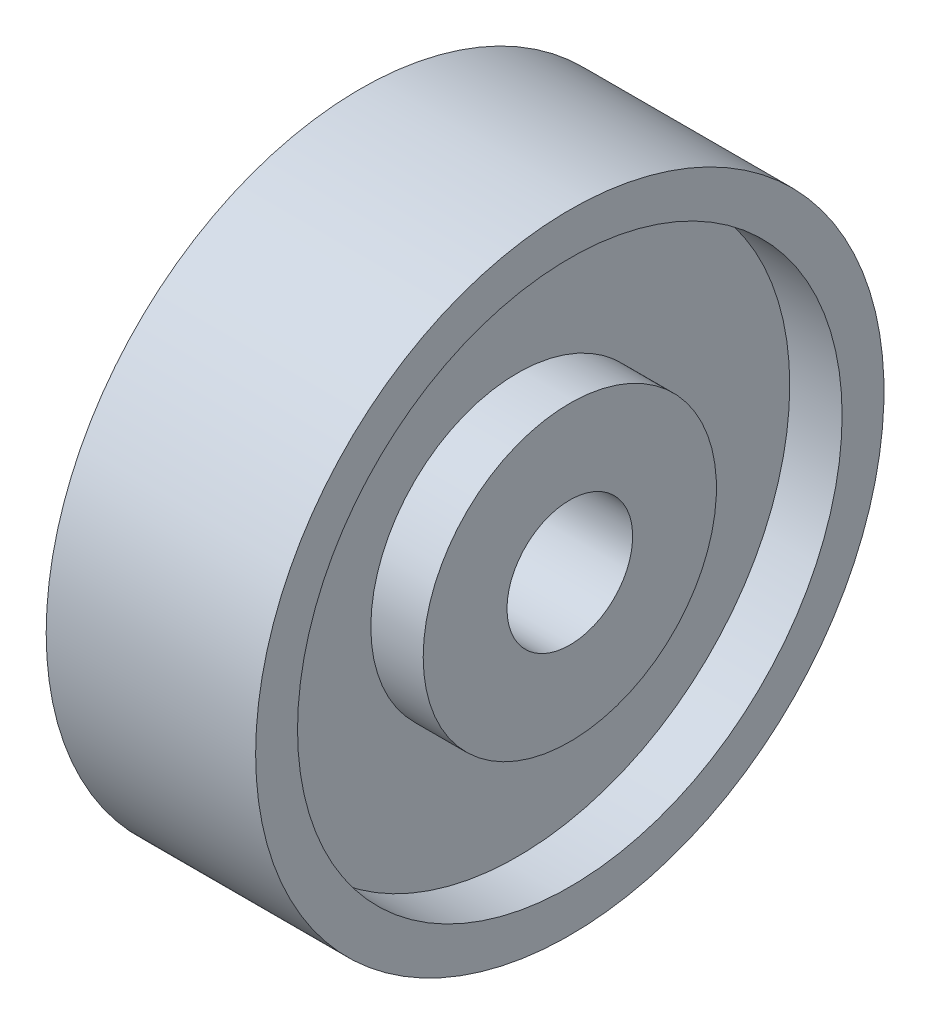
ISO-10303-21;
HEADER;
FILE_DESCRIPTION(('STEP AP214'),'2;1');
FILE_NAME('part.step','',(''),(''),'','','');
FILE_SCHEMA(('AUTOMOTIVE_DESIGN { 1 0 10303 214 1 1 1 1 }'));
ENDSEC;
DATA;
#1=APPLICATION_CONTEXT('core data for automotive mechanical design processes');
#2=APPLICATION_PROTOCOL_DEFINITION('international standard','automotive_design',2000,#1);
#3=PRODUCT_CONTEXT('',#1,'mechanical');
#4=PRODUCT('Part','Part','',(#3));
#5=PRODUCT_RELATED_PRODUCT_CATEGORY('part','',(#4));
#6=PRODUCT_DEFINITION_FORMATION('','',#4);
#7=PRODUCT_DEFINITION_CONTEXT('part definition',#1,'design');
#8=PRODUCT_DEFINITION('design','',#6,#7);
#9=PRODUCT_DEFINITION_SHAPE('','',#8);
#10=(LENGTH_UNIT() NAMED_UNIT(*) SI_UNIT(.MILLI.,.METRE.));
#11=(NAMED_UNIT(*) PLANE_ANGLE_UNIT() SI_UNIT($,.RADIAN.));
#12=(NAMED_UNIT(*) SI_UNIT($,.STERADIAN.) SOLID_ANGLE_UNIT());
#13=UNCERTAINTY_MEASURE_WITH_UNIT(LENGTH_MEASURE(1.E-05),#10,'distance_accuracy_value','');
#14=(GEOMETRIC_REPRESENTATION_CONTEXT(3) GLOBAL_UNCERTAINTY_ASSIGNED_CONTEXT((#13)) GLOBAL_UNIT_ASSIGNED_CONTEXT((#10,
#11,#12)) REPRESENTATION_CONTEXT('',''));
#15=CARTESIAN_POINT('',(0.,0.,0.));
#16=DIRECTION('',(0.,0.,1.));
#17=DIRECTION('',(1.,0.,0.));
#18=AXIS2_PLACEMENT_3D('',#15,#16,#17);
#19=CARTESIAN_POINT('',(5.00000000000002,3.,0.));
#20=DIRECTION('',(-1.,0.,0.));
#21=DIRECTION('',(0.,0.,1.));
#22=AXIS2_PLACEMENT_3D('',#19,#20,#21);
#23=PLANE('',#22);
#24=CARTESIAN_POINT('',(5.,0.,0.));
#25=DIRECTION('',(-1.,0.,0.));
#26=DIRECTION('',(0.,0.,1.));
#27=AXIS2_PLACEMENT_3D('',#24,#25,#26);
#28=CIRCLE('',#27,7.);
#29=CARTESIAN_POINT('',(5.,0.,7.));
#30=VERTEX_POINT('',#29);
#31=EDGE_CURVE('E10',#30,#30,#28,.T.);
#32=ORIENTED_EDGE('',*,*,#31,.F.);
#33=EDGE_LOOP('',(#32));
#34=FACE_BOUND('',#33,.T.);
#35=CARTESIAN_POINT('',(5.,0.,0.));
#36=DIRECTION('',(-1.,0.,0.));
#37=DIRECTION('',(0.,0.,1.));
#38=AXIS2_PLACEMENT_3D('',#35,#36,#37);
#39=CIRCLE('',#38,3.);
#40=CARTESIAN_POINT('',(5.,0.,3.));
#41=VERTEX_POINT('',#40);
#42=EDGE_CURVE('E73',#41,#41,#39,.T.);
#43=ORIENTED_EDGE('',*,*,#42,.T.);
#44=EDGE_LOOP('',(#43));
#45=FACE_BOUND('',#44,.T.);
#46=ADVANCED_FACE('F33',(#34,#45),#23,.F.);
#47=CARTESIAN_POINT('',(-265.452917718949,0.,0.));
#48=DIRECTION('',(-1.,0.,0.));
#49=DIRECTION('',(0.,0.,1.));
#50=AXIS2_PLACEMENT_3D('',#47,#48,#49);
#51=CYLINDRICAL_SURFACE('',#50,7.);
#52=CARTESIAN_POINT('',(2.5,0.,0.));
#53=DIRECTION('',(-1.,0.,0.));
#54=DIRECTION('',(0.,0.,1.));
#55=AXIS2_PLACEMENT_3D('',#52,#53,#54);
#56=CIRCLE('',#55,7.);
#57=CARTESIAN_POINT('',(2.5,0.,7.));
#58=VERTEX_POINT('',#57);
#59=EDGE_CURVE('E39',#58,#58,#56,.T.);
#60=ORIENTED_EDGE('',*,*,#59,.F.);
#61=EDGE_LOOP('',(#60));
#62=FACE_BOUND('',#61,.T.);
#63=ORIENTED_EDGE('',*,*,#31,.T.);
#64=EDGE_LOOP('',(#63));
#65=FACE_BOUND('',#64,.T.);
#66=ADVANCED_FACE('F134',(#62,#65),#51,.T.);
#67=CARTESIAN_POINT('',(2.50000000000002,7.,0.));
#68=DIRECTION('',(-1.,0.,0.));
#69=DIRECTION('',(0.,0.,1.));
#70=AXIS2_PLACEMENT_3D('',#67,#68,#69);
#71=PLANE('',#70);
#72=CARTESIAN_POINT('',(2.5,0.,0.));
#73=DIRECTION('',(-1.,0.,0.));
#74=DIRECTION('',(0.,0.,1.));
#75=AXIS2_PLACEMENT_3D('',#72,#73,#74);
#76=CIRCLE('',#75,13.);
#77=CARTESIAN_POINT('',(2.5,0.,13.));
#78=VERTEX_POINT('',#77);
#79=EDGE_CURVE('E43',#78,#78,#76,.T.);
#80=ORIENTED_EDGE('',*,*,#79,.F.);
#81=EDGE_LOOP('',(#80));
#82=FACE_BOUND('',#81,.T.);
#83=ORIENTED_EDGE('',*,*,#59,.T.);
#84=EDGE_LOOP('',(#83));
#85=FACE_BOUND('',#84,.T.);
#86=ADVANCED_FACE('F129',(#82,#85),#71,.F.);
#87=CARTESIAN_POINT('',(-265.452917718949,0.,0.));
#88=DIRECTION('',(-1.,0.,0.));
#89=DIRECTION('',(0.,0.,1.));
#90=AXIS2_PLACEMENT_3D('',#87,#88,#89);
#91=CYLINDRICAL_SURFACE('',#90,13.);
#92=CARTESIAN_POINT('',(5.,0.,0.));
#93=DIRECTION('',(-1.,0.,0.));
#94=DIRECTION('',(0.,0.,1.));
#95=AXIS2_PLACEMENT_3D('',#92,#93,#94);
#96=CIRCLE('',#95,13.);
#97=CARTESIAN_POINT('',(5.,0.,13.));
#98=VERTEX_POINT('',#97);
#99=EDGE_CURVE('E47',#98,#98,#96,.T.);
#100=ORIENTED_EDGE('',*,*,#99,.F.);
#101=EDGE_LOOP('',(#100));
#102=FACE_BOUND('',#101,.T.);
#103=ORIENTED_EDGE('',*,*,#79,.T.);
#104=EDGE_LOOP('',(#103));
#105=FACE_BOUND('',#104,.T.);
#106=ADVANCED_FACE('F123',(#102,#105),#91,.F.);
#107=CARTESIAN_POINT('',(5.00000000000002,13.,0.));
#108=DIRECTION('',(-1.,0.,0.));
#109=DIRECTION('',(0.,0.,1.));
#110=AXIS2_PLACEMENT_3D('',#107,#108,#109);
#111=PLANE('',#110);
#112=CARTESIAN_POINT('',(5.,0.,0.));
#113=DIRECTION('',(-1.,0.,0.));
#114=DIRECTION('',(0.,0.,1.));
#115=AXIS2_PLACEMENT_3D('',#112,#113,#114);
#116=CIRCLE('',#115,15.);
#117=CARTESIAN_POINT('',(5.,0.,15.));
#118=VERTEX_POINT('',#117);
#119=EDGE_CURVE('E52',#118,#118,#116,.T.);
#120=ORIENTED_EDGE('',*,*,#119,.F.);
#121=EDGE_LOOP('',(#120));
#122=FACE_BOUND('',#121,.T.);
#123=ORIENTED_EDGE('',*,*,#99,.T.);
#124=EDGE_LOOP('',(#123));
#125=FACE_BOUND('',#124,.T.);
#126=ADVANCED_FACE('F117',(#122,#125),#111,.F.);
#127=CARTESIAN_POINT('',(-265.452917718949,0.,0.));
#128=DIRECTION('',(-1.,0.,0.));
#129=DIRECTION('',(0.,0.,1.));
#130=AXIS2_PLACEMENT_3D('',#127,#128,#129);
#131=CYLINDRICAL_SURFACE('',#130,15.);
#132=CARTESIAN_POINT('',(-5.,0.,0.));
#133=DIRECTION('',(-1.,0.,0.));
#134=DIRECTION('',(0.,0.,1.));
#135=AXIS2_PLACEMENT_3D('',#132,#133,#134);
#136=CIRCLE('',#135,15.);
#137=CARTESIAN_POINT('',(-5.,0.,15.));
#138=VERTEX_POINT('',#137);
#139=EDGE_CURVE('E55',#138,#138,#136,.T.);
#140=ORIENTED_EDGE('',*,*,#139,.F.);
#141=EDGE_LOOP('',(#140));
#142=FACE_BOUND('',#141,.T.);
#143=ORIENTED_EDGE('',*,*,#119,.T.);
#144=EDGE_LOOP('',(#143));
#145=FACE_BOUND('',#144,.T.);
#146=ADVANCED_FACE('F111',(#142,#145),#131,.T.);
#147=CARTESIAN_POINT('',(-4.99999999999998,15.,0.));
#148=DIRECTION('',(1.,0.,0.));
#149=DIRECTION('',(0.,0.,-1.));
#150=AXIS2_PLACEMENT_3D('',#147,#148,#149);
#151=PLANE('',#150);
#152=CARTESIAN_POINT('',(-5.,0.,0.));
#153=DIRECTION('',(-1.,0.,0.));
#154=DIRECTION('',(0.,0.,1.));
#155=AXIS2_PLACEMENT_3D('',#152,#153,#154);
#156=CIRCLE('',#155,13.);
#157=CARTESIAN_POINT('',(-5.,0.,13.));
#158=VERTEX_POINT('',#157);
#159=EDGE_CURVE('E58',#158,#158,#156,.T.);
#160=ORIENTED_EDGE('',*,*,#159,.F.);
#161=EDGE_LOOP('',(#160));
#162=FACE_BOUND('',#161,.T.);
#163=ORIENTED_EDGE('',*,*,#139,.T.);
#164=EDGE_LOOP('',(#163));
#165=FACE_BOUND('',#164,.T.);
#166=ADVANCED_FACE('F105',(#162,#165),#151,.F.);
#167=CARTESIAN_POINT('',(-265.452917718949,0.,0.));
#168=DIRECTION('',(-1.,0.,0.));
#169=DIRECTION('',(0.,0.,1.));
#170=AXIS2_PLACEMENT_3D('',#167,#168,#169);
#171=CYLINDRICAL_SURFACE('',#170,13.);
#172=CARTESIAN_POINT('',(-2.5,0.,0.));
#173=DIRECTION('',(-1.,0.,0.));
#174=DIRECTION('',(0.,0.,1.));
#175=AXIS2_PLACEMENT_3D('',#172,#173,#174);
#176=CIRCLE('',#175,13.);
#177=CARTESIAN_POINT('',(-2.5,0.,13.));
#178=VERTEX_POINT('',#177);
#179=EDGE_CURVE('E61',#178,#178,#176,.T.);
#180=ORIENTED_EDGE('',*,*,#179,.F.);
#181=EDGE_LOOP('',(#180));
#182=FACE_BOUND('',#181,.T.);
#183=ORIENTED_EDGE('',*,*,#159,.T.);
#184=EDGE_LOOP('',(#183));
#185=FACE_BOUND('',#184,.T.);
#186=ADVANCED_FACE('F99',(#182,#185),#171,.F.);
#187=CARTESIAN_POINT('',(-2.49999999999998,13.,0.));
#188=DIRECTION('',(1.,0.,0.));
#189=DIRECTION('',(0.,0.,-1.));
#190=AXIS2_PLACEMENT_3D('',#187,#188,#189);
#191=PLANE('',#190);
#192=CARTESIAN_POINT('',(-2.5,0.,0.));
#193=DIRECTION('',(-1.,0.,0.));
#194=DIRECTION('',(0.,0.,1.));
#195=AXIS2_PLACEMENT_3D('',#192,#193,#194);
#196=CIRCLE('',#195,7.);
#197=CARTESIAN_POINT('',(-2.5,0.,7.));
#198=VERTEX_POINT('',#197);
#199=EDGE_CURVE('E64',#198,#198,#196,.T.);
#200=ORIENTED_EDGE('',*,*,#199,.F.);
#201=EDGE_LOOP('',(#200));
#202=FACE_BOUND('',#201,.T.);
#203=ORIENTED_EDGE('',*,*,#179,.T.);
#204=EDGE_LOOP('',(#203));
#205=FACE_BOUND('',#204,.T.);
#206=ADVANCED_FACE('F93',(#202,#205),#191,.F.);
#207=CARTESIAN_POINT('',(-265.452917718949,0.,0.));
#208=DIRECTION('',(-1.,0.,0.));
#209=DIRECTION('',(0.,0.,1.));
#210=AXIS2_PLACEMENT_3D('',#207,#208,#209);
#211=CYLINDRICAL_SURFACE('',#210,7.);
#212=CARTESIAN_POINT('',(-5.,0.,0.));
#213=DIRECTION('',(-1.,0.,0.));
#214=DIRECTION('',(0.,0.,1.));
#215=AXIS2_PLACEMENT_3D('',#212,#213,#214);
#216=CIRCLE('',#215,7.);
#217=CARTESIAN_POINT('',(-5.,0.,7.));
#218=VERTEX_POINT('',#217);
#219=EDGE_CURVE('E67',#218,#218,#216,.T.);
#220=ORIENTED_EDGE('',*,*,#219,.F.);
#221=EDGE_LOOP('',(#220));
#222=FACE_BOUND('',#221,.T.);
#223=ORIENTED_EDGE('',*,*,#199,.T.);
#224=EDGE_LOOP('',(#223));
#225=FACE_BOUND('',#224,.T.);
#226=ADVANCED_FACE('F87',(#222,#225),#211,.T.);
#227=CARTESIAN_POINT('',(-4.99999999999998,7.,0.));
#228=DIRECTION('',(1.,0.,0.));
#229=DIRECTION('',(0.,0.,-1.));
#230=AXIS2_PLACEMENT_3D('',#227,#228,#229);
#231=PLANE('',#230);
#232=CARTESIAN_POINT('',(-5.,0.,0.));
#233=DIRECTION('',(-1.,0.,0.));
#234=DIRECTION('',(0.,0.,1.));
#235=AXIS2_PLACEMENT_3D('',#232,#233,#234);
#236=CIRCLE('',#235,3.);
#237=CARTESIAN_POINT('',(-5.,0.,3.));
#238=VERTEX_POINT('',#237);
#239=EDGE_CURVE('E70',#238,#238,#236,.T.);
#240=ORIENTED_EDGE('',*,*,#239,.F.);
#241=EDGE_LOOP('',(#240));
#242=FACE_BOUND('',#241,.T.);
#243=ORIENTED_EDGE('',*,*,#219,.T.);
#244=EDGE_LOOP('',(#243));
#245=FACE_BOUND('',#244,.T.);
#246=ADVANCED_FACE('F81',(#242,#245),#231,.F.);
#247=CARTESIAN_POINT('',(-265.452917718949,0.,0.));
#248=DIRECTION('',(-1.,0.,0.));
#249=DIRECTION('',(0.,0.,1.));
#250=AXIS2_PLACEMENT_3D('',#247,#248,#249);
#251=CYLINDRICAL_SURFACE('',#250,3.);
#252=ORIENTED_EDGE('',*,*,#42,.F.);
#253=EDGE_LOOP('',(#252));
#254=FACE_BOUND('',#253,.T.);
#255=ORIENTED_EDGE('',*,*,#239,.T.);
#256=EDGE_LOOP('',(#255));
#257=FACE_BOUND('',#256,.T.);
#258=ADVANCED_FACE('F78',(#254,#257),#251,.F.);
#259=CLOSED_SHELL('',(#46,#66,#86,#106,#126,#146,#166,#186,#206,#226,#246,#258));
#260=MANIFOLD_SOLID_BREP('B2',#259);
#261=ADVANCED_BREP_SHAPE_REPRESENTATION('',(#18,#260),#14);
#262=SHAPE_DEFINITION_REPRESENTATION(#9,#261);
ENDSEC;
END-ISO-10303-21;
